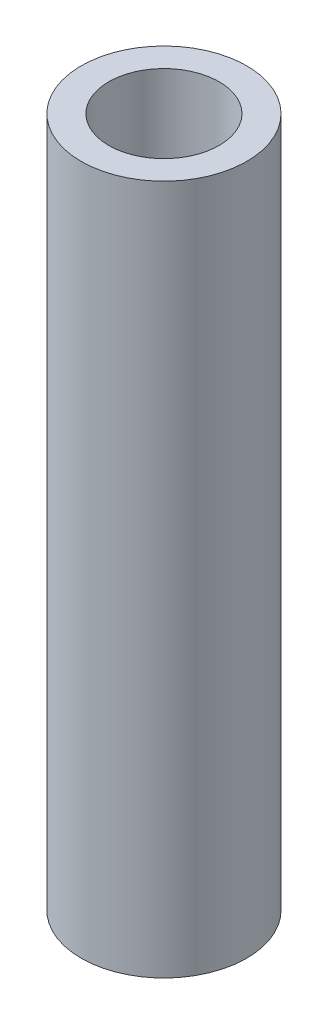
ISO-10303-21;
HEADER;
FILE_DESCRIPTION(('STEP AP214'),'2;1');
FILE_NAME('part.step','',(''),(''),'','','');
FILE_SCHEMA(('AUTOMOTIVE_DESIGN { 1 0 10303 214 1 1 1 1 }'));
ENDSEC;
DATA;
#1=APPLICATION_CONTEXT('core data for automotive mechanical design processes');
#2=APPLICATION_PROTOCOL_DEFINITION('international standard','automotive_design',2000,#1);
#3=PRODUCT_CONTEXT('',#1,'mechanical');
#4=PRODUCT('Part','Part','',(#3));
#5=PRODUCT_RELATED_PRODUCT_CATEGORY('part','',(#4));
#6=PRODUCT_DEFINITION_FORMATION('','',#4);
#7=PRODUCT_DEFINITION_CONTEXT('part definition',#1,'design');
#8=PRODUCT_DEFINITION('design','',#6,#7);
#9=PRODUCT_DEFINITION_SHAPE('','',#8);
#10=(LENGTH_UNIT() NAMED_UNIT(*) SI_UNIT(.MILLI.,.METRE.));
#11=(NAMED_UNIT(*) PLANE_ANGLE_UNIT() SI_UNIT($,.RADIAN.));
#12=(NAMED_UNIT(*) SI_UNIT($,.STERADIAN.) SOLID_ANGLE_UNIT());
#13=UNCERTAINTY_MEASURE_WITH_UNIT(LENGTH_MEASURE(1.E-05),#10,'distance_accuracy_value','');
#14=(GEOMETRIC_REPRESENTATION_CONTEXT(3) GLOBAL_UNCERTAINTY_ASSIGNED_CONTEXT((#13)) GLOBAL_UNIT_ASSIGNED_CONTEXT((#10,
#11,#12)) REPRESENTATION_CONTEXT('',''));
#15=CARTESIAN_POINT('',(0.,0.,0.));
#16=DIRECTION('',(0.,0.,1.));
#17=DIRECTION('',(1.,0.,0.));
#18=AXIS2_PLACEMENT_3D('',#15,#16,#17);
#19=CARTESIAN_POINT('',(0.,25.,0.));
#20=DIRECTION('',(0.,1.,0.));
#21=DIRECTION('',(0.,0.,1.));
#22=AXIS2_PLACEMENT_3D('',#19,#20,#21);
#23=PLANE('',#22);
#24=CARTESIAN_POINT('',(0.,25.,0.));
#25=DIRECTION('',(0.,1.,0.));
#26=DIRECTION('',(0.,0.,1.));
#27=AXIS2_PLACEMENT_3D('',#24,#25,#26);
#28=CIRCLE('',#27,3.);
#29=CARTESIAN_POINT('',(0.,25.,3.));
#30=VERTEX_POINT('',#29);
#31=EDGE_CURVE('E10',#30,#30,#28,.T.);
#32=ORIENTED_EDGE('',*,*,#31,.T.);
#33=EDGE_LOOP('',(#32));
#34=FACE_BOUND('',#33,.T.);
#35=CARTESIAN_POINT('',(0.,25.,0.));
#36=DIRECTION('',(0.,1.,0.));
#37=DIRECTION('',(0.,0.,1.));
#38=AXIS2_PLACEMENT_3D('',#35,#36,#37);
#39=CIRCLE('',#38,2.);
#40=CARTESIAN_POINT('',(0.,25.,2.));
#41=VERTEX_POINT('',#40);
#42=EDGE_CURVE('E44',#41,#41,#39,.T.);
#43=ORIENTED_EDGE('',*,*,#42,.F.);
#44=EDGE_LOOP('',(#43));
#45=FACE_BOUND('',#44,.T.);
#46=ADVANCED_FACE('F33',(#34,#45),#23,.T.);
#47=CARTESIAN_POINT('',(0.,0.,0.));
#48=DIRECTION('',(0.,1.,0.));
#49=DIRECTION('',(0.,0.,1.));
#50=AXIS2_PLACEMENT_3D('',#47,#48,#49);
#51=PLANE('',#50);
#52=CARTESIAN_POINT('',(0.,0.,0.));
#53=DIRECTION('',(0.,1.,0.));
#54=DIRECTION('',(0.,0.,1.));
#55=AXIS2_PLACEMENT_3D('',#52,#53,#54);
#56=CIRCLE('',#55,3.);
#57=CARTESIAN_POINT('',(0.,0.,3.));
#58=VERTEX_POINT('',#57);
#59=EDGE_CURVE('E37',#58,#58,#56,.T.);
#60=ORIENTED_EDGE('',*,*,#59,.F.);
#61=EDGE_LOOP('',(#60));
#62=FACE_BOUND('',#61,.T.);
#63=CARTESIAN_POINT('',(0.,0.,0.));
#64=DIRECTION('',(0.,1.,0.));
#65=DIRECTION('',(0.,0.,1.));
#66=AXIS2_PLACEMENT_3D('',#63,#64,#65);
#67=CIRCLE('',#66,2.);
#68=CARTESIAN_POINT('',(0.,0.,2.));
#69=VERTEX_POINT('',#68);
#70=EDGE_CURVE('E46',#69,#69,#67,.T.);
#71=ORIENTED_EDGE('',*,*,#70,.T.);
#72=EDGE_LOOP('',(#71));
#73=FACE_BOUND('',#72,.T.);
#74=ADVANCED_FACE('F56',(#62,#73),#51,.F.);
#75=CARTESIAN_POINT('',(0.,25.,0.));
#76=DIRECTION('',(0.,-1.,0.));
#77=DIRECTION('',(0.,0.,-1.));
#78=AXIS2_PLACEMENT_3D('',#75,#76,#77);
#79=CYLINDRICAL_SURFACE('',#78,3.);
#80=ORIENTED_EDGE('',*,*,#31,.F.);
#81=EDGE_LOOP('',(#80));
#82=FACE_BOUND('',#81,.T.);
#83=ORIENTED_EDGE('',*,*,#59,.T.);
#84=EDGE_LOOP('',(#83));
#85=FACE_BOUND('',#84,.T.);
#86=ADVANCED_FACE('F35',(#82,#85),#79,.T.);
#87=CARTESIAN_POINT('',(0.,25.,0.));
#88=DIRECTION('',(0.,-1.,0.));
#89=DIRECTION('',(0.,0.,-1.));
#90=AXIS2_PLACEMENT_3D('',#87,#88,#89);
#91=CYLINDRICAL_SURFACE('',#90,2.);
#92=ORIENTED_EDGE('',*,*,#42,.T.);
#93=EDGE_LOOP('',(#92));
#94=FACE_BOUND('',#93,.T.);
#95=ORIENTED_EDGE('',*,*,#70,.F.);
#96=EDGE_LOOP('',(#95));
#97=FACE_BOUND('',#96,.T.);
#98=ADVANCED_FACE('F52',(#94,#97),#91,.F.);
#99=CLOSED_SHELL('',(#46,#74,#86,#98));
#100=MANIFOLD_SOLID_BREP('B2',#99);
#101=ADVANCED_BREP_SHAPE_REPRESENTATION('',(#18,#100),#14);
#102=SHAPE_DEFINITION_REPRESENTATION(#9,#101);
ENDSEC;
END-ISO-10303-21;
